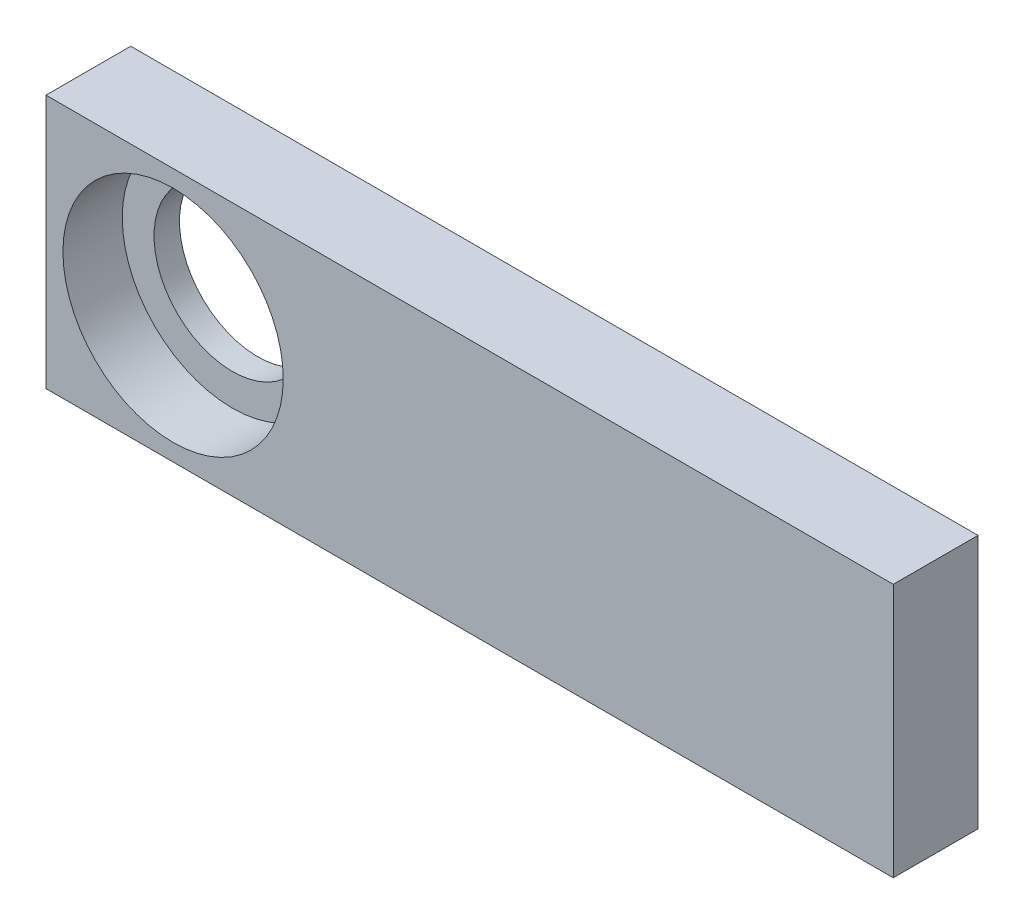
ISO-10303-21;
HEADER;
FILE_DESCRIPTION(('STEP AP214'),'2;1');
FILE_NAME('part.step','',(''),(''),'','','');
FILE_SCHEMA(('AUTOMOTIVE_DESIGN { 1 0 10303 214 1 1 1 1 }'));
ENDSEC;
DATA;
#1=APPLICATION_CONTEXT('core data for automotive mechanical design processes');
#2=APPLICATION_PROTOCOL_DEFINITION('international standard','automotive_design',2000,#1);
#3=PRODUCT_CONTEXT('',#1,'mechanical');
#4=PRODUCT('Part','Part','',(#3));
#5=PRODUCT_RELATED_PRODUCT_CATEGORY('part','',(#4));
#6=PRODUCT_DEFINITION_FORMATION('','',#4);
#7=PRODUCT_DEFINITION_CONTEXT('part definition',#1,'design');
#8=PRODUCT_DEFINITION('design','',#6,#7);
#9=PRODUCT_DEFINITION_SHAPE('','',#8);
#10=(LENGTH_UNIT() NAMED_UNIT(*) SI_UNIT(.MILLI.,.METRE.));
#11=(NAMED_UNIT(*) PLANE_ANGLE_UNIT() SI_UNIT($,.RADIAN.));
#12=(NAMED_UNIT(*) SI_UNIT($,.STERADIAN.) SOLID_ANGLE_UNIT());
#13=UNCERTAINTY_MEASURE_WITH_UNIT(LENGTH_MEASURE(1.E-05),#10,'distance_accuracy_value','');
#14=(GEOMETRIC_REPRESENTATION_CONTEXT(3) GLOBAL_UNCERTAINTY_ASSIGNED_CONTEXT((#13)) GLOBAL_UNIT_ASSIGNED_CONTEXT((#10,
#11,#12)) REPRESENTATION_CONTEXT('',''));
#15=CARTESIAN_POINT('',(0.,0.,0.));
#16=DIRECTION('',(0.,0.,1.));
#17=DIRECTION('',(1.,0.,0.));
#18=AXIS2_PLACEMENT_3D('',#15,#16,#17);
#19=CARTESIAN_POINT('',(0.,30.,10.));
#20=DIRECTION('',(1.,0.,0.));
#21=DIRECTION('',(0.,0.,-1.));
#22=AXIS2_PLACEMENT_3D('',#19,#20,#21);
#23=PLANE('',#22);
#24=DIRECTION('',(0.,-1.,0.));
#25=VECTOR('',#24,1.);
#26=CARTESIAN_POINT('',(0.,30.,0.));
#27=LINE('',#26,#25);
#28=CARTESIAN_POINT('',(0.,30.,0.));
#29=VERTEX_POINT('',#28);
#30=CARTESIAN_POINT('',(0.,0.,0.));
#31=VERTEX_POINT('',#30);
#32=EDGE_CURVE('E94',#29,#31,#27,.T.);
#33=ORIENTED_EDGE('',*,*,#32,.T.);
#34=DIRECTION('',(0.,0.,-1.));
#35=VECTOR('',#34,1.);
#36=CARTESIAN_POINT('',(0.,0.,10.));
#37=LINE('',#36,#35);
#38=CARTESIAN_POINT('',(0.,0.,10.));
#39=VERTEX_POINT('',#38);
#40=EDGE_CURVE('E11',#39,#31,#37,.T.);
#41=ORIENTED_EDGE('',*,*,#40,.F.);
#42=DIRECTION('',(0.,-1.,0.));
#43=VECTOR('',#42,1.);
#44=CARTESIAN_POINT('',(0.,30.,10.));
#45=LINE('',#44,#43);
#46=CARTESIAN_POINT('',(0.,30.,10.));
#47=VERTEX_POINT('',#46);
#48=EDGE_CURVE('E82',#47,#39,#45,.T.);
#49=ORIENTED_EDGE('',*,*,#48,.F.);
#50=DIRECTION('',(0.,0.,-1.));
#51=VECTOR('',#50,1.);
#52=CARTESIAN_POINT('',(0.,30.,10.));
#53=LINE('',#52,#51);
#54=EDGE_CURVE('E90',#47,#29,#53,.T.);
#55=ORIENTED_EDGE('',*,*,#54,.T.);
#56=EDGE_LOOP('',(#33,#41,#49,#55));
#57=FACE_BOUND('',#56,.T.);
#58=ADVANCED_FACE('F31',(#57),#23,.F.);
#59=CARTESIAN_POINT('',(0.,0.,10.));
#60=DIRECTION('',(0.,1.,0.));
#61=DIRECTION('',(0.,0.,1.));
#62=AXIS2_PLACEMENT_3D('',#59,#60,#61);
#63=PLANE('',#62);
#64=DIRECTION('',(1.,0.,0.));
#65=VECTOR('',#64,1.);
#66=CARTESIAN_POINT('',(0.,0.,0.));
#67=LINE('',#66,#65);
#68=CARTESIAN_POINT('',(100.,0.,0.));
#69=VERTEX_POINT('',#68);
#70=EDGE_CURVE('E86',#31,#69,#67,.T.);
#71=ORIENTED_EDGE('',*,*,#70,.T.);
#72=DIRECTION('',(0.,0.,-1.));
#73=VECTOR('',#72,1.);
#74=CARTESIAN_POINT('',(100.,0.,10.));
#75=LINE('',#74,#73);
#76=CARTESIAN_POINT('',(100.,0.,10.));
#77=VERTEX_POINT('',#76);
#78=EDGE_CURVE('E39',#77,#69,#75,.T.);
#79=ORIENTED_EDGE('',*,*,#78,.F.);
#80=DIRECTION('',(1.,0.,0.));
#81=VECTOR('',#80,1.);
#82=CARTESIAN_POINT('',(0.,0.,10.));
#83=LINE('',#82,#81);
#84=EDGE_CURVE('E77',#39,#77,#83,.T.);
#85=ORIENTED_EDGE('',*,*,#84,.F.);
#86=ORIENTED_EDGE('',*,*,#40,.T.);
#87=EDGE_LOOP('',(#71,#79,#85,#86));
#88=FACE_BOUND('',#87,.T.);
#89=ADVANCED_FACE('F85',(#88),#63,.F.);
#90=CARTESIAN_POINT('',(100.,30.,10.));
#91=DIRECTION('',(-1.,0.,0.));
#92=DIRECTION('',(0.,0.,1.));
#93=AXIS2_PLACEMENT_3D('',#90,#91,#92);
#94=PLANE('',#93);
#95=DIRECTION('',(0.,1.,0.));
#96=VECTOR('',#95,1.);
#97=CARTESIAN_POINT('',(100.,30.,0.));
#98=LINE('',#97,#96);
#99=CARTESIAN_POINT('',(100.,30.,0.));
#100=VERTEX_POINT('',#99);
#101=EDGE_CURVE('E64',#69,#100,#98,.T.);
#102=ORIENTED_EDGE('',*,*,#101,.T.);
#103=DIRECTION('',(0.,0.,-1.));
#104=VECTOR('',#103,1.);
#105=CARTESIAN_POINT('',(100.,30.,10.));
#106=LINE('',#105,#104);
#107=CARTESIAN_POINT('',(100.,30.,10.));
#108=VERTEX_POINT('',#107);
#109=EDGE_CURVE('E87',#108,#100,#106,.T.);
#110=ORIENTED_EDGE('',*,*,#109,.F.);
#111=DIRECTION('',(0.,1.,0.));
#112=VECTOR('',#111,1.);
#113=CARTESIAN_POINT('',(100.,30.,10.));
#114=LINE('',#113,#112);
#115=EDGE_CURVE('E80',#77,#108,#114,.T.);
#116=ORIENTED_EDGE('',*,*,#115,.F.);
#117=ORIENTED_EDGE('',*,*,#78,.T.);
#118=EDGE_LOOP('',(#102,#110,#116,#117));
#119=FACE_BOUND('',#118,.T.);
#120=ADVANCED_FACE('F88',(#119),#94,.F.);
#121=CARTESIAN_POINT('',(0.,30.,10.));
#122=DIRECTION('',(0.,-1.,0.));
#123=DIRECTION('',(0.,0.,-1.));
#124=AXIS2_PLACEMENT_3D('',#121,#122,#123);
#125=PLANE('',#124);
#126=DIRECTION('',(-1.,0.,0.));
#127=VECTOR('',#126,1.);
#128=CARTESIAN_POINT('',(0.,30.,0.));
#129=LINE('',#128,#127);
#130=EDGE_CURVE('E70',#100,#29,#129,.T.);
#131=ORIENTED_EDGE('',*,*,#130,.T.);
#132=ORIENTED_EDGE('',*,*,#54,.F.);
#133=DIRECTION('',(-1.,0.,0.));
#134=VECTOR('',#133,1.);
#135=CARTESIAN_POINT('',(0.,30.,10.));
#136=LINE('',#135,#134);
#137=EDGE_CURVE('E47',#108,#47,#136,.T.);
#138=ORIENTED_EDGE('',*,*,#137,.F.);
#139=ORIENTED_EDGE('',*,*,#109,.T.);
#140=EDGE_LOOP('',(#131,#132,#138,#139));
#141=FACE_BOUND('',#140,.T.);
#142=ADVANCED_FACE('F102',(#141),#125,.F.);
#143=CARTESIAN_POINT('',(0.,0.,10.));
#144=DIRECTION('',(0.,0.,1.));
#145=DIRECTION('',(1.,0.,0.));
#146=AXIS2_PLACEMENT_3D('',#143,#144,#145);
#147=PLANE('',#146);
#148=CARTESIAN_POINT('',(15.,15.,10.));
#149=DIRECTION('',(0.,0.,1.));
#150=DIRECTION('',(1.,0.,0.));
#151=AXIS2_PLACEMENT_3D('',#148,#149,#150);
#152=CIRCLE('',#151,13.);
#153=CARTESIAN_POINT('',(28.,15.,10.));
#154=VERTEX_POINT('',#153);
#155=EDGE_CURVE('E108',#154,#154,#152,.T.);
#156=ORIENTED_EDGE('',*,*,#155,.F.);
#157=EDGE_LOOP('',(#156));
#158=FACE_BOUND('',#157,.T.);
#159=ORIENTED_EDGE('',*,*,#48,.T.);
#160=ORIENTED_EDGE('',*,*,#84,.T.);
#161=ORIENTED_EDGE('',*,*,#115,.T.);
#162=ORIENTED_EDGE('',*,*,#137,.T.);
#163=EDGE_LOOP('',(#159,#160,#161,#162));
#164=FACE_BOUND('',#163,.T.);
#165=ADVANCED_FACE('F78',(#158,#164),#147,.T.);
#166=CARTESIAN_POINT('',(0.,0.,0.));
#167=DIRECTION('',(0.,0.,1.));
#168=DIRECTION('',(1.,0.,0.));
#169=AXIS2_PLACEMENT_3D('',#166,#167,#168);
#170=PLANE('',#169);
#171=CARTESIAN_POINT('',(15.,15.,0.));
#172=DIRECTION('',(0.,0.,1.));
#173=DIRECTION('',(1.,0.,0.));
#174=AXIS2_PLACEMENT_3D('',#171,#172,#173);
#175=CIRCLE('',#174,9.25);
#176=CARTESIAN_POINT('',(24.25,15.,0.));
#177=VERTEX_POINT('',#176);
#178=EDGE_CURVE('E111',#177,#177,#175,.T.);
#179=ORIENTED_EDGE('',*,*,#178,.T.);
#180=EDGE_LOOP('',(#179));
#181=FACE_BOUND('',#180,.T.);
#182=ORIENTED_EDGE('',*,*,#32,.F.);
#183=ORIENTED_EDGE('',*,*,#130,.F.);
#184=ORIENTED_EDGE('',*,*,#101,.F.);
#185=ORIENTED_EDGE('',*,*,#70,.F.);
#186=EDGE_LOOP('',(#182,#183,#184,#185));
#187=FACE_BOUND('',#186,.T.);
#188=ADVANCED_FACE('F105',(#181,#187),#170,.F.);
#189=CARTESIAN_POINT('',(15.,15.,3.));
#190=DIRECTION('',(0.,0.,1.));
#191=DIRECTION('',(1.,0.,0.));
#192=AXIS2_PLACEMENT_3D('',#189,#190,#191);
#193=CYLINDRICAL_SURFACE('',#192,13.);
#194=CARTESIAN_POINT('',(15.,15.,3.));
#195=DIRECTION('',(0.,0.,1.));
#196=DIRECTION('',(1.,0.,0.));
#197=AXIS2_PLACEMENT_3D('',#194,#195,#196);
#198=CIRCLE('',#197,13.);
#199=CARTESIAN_POINT('',(28.,15.,3.));
#200=VERTEX_POINT('',#199);
#201=EDGE_CURVE('E97',#200,#200,#198,.T.);
#202=ORIENTED_EDGE('',*,*,#201,.F.);
#203=EDGE_LOOP('',(#202));
#204=FACE_BOUND('',#203,.T.);
#205=ORIENTED_EDGE('',*,*,#155,.T.);
#206=EDGE_LOOP('',(#205));
#207=FACE_BOUND('',#206,.T.);
#208=ADVANCED_FACE('F130',(#204,#207),#193,.F.);
#209=CARTESIAN_POINT('',(15.,15.,3.));
#210=DIRECTION('',(0.,0.,1.));
#211=DIRECTION('',(1.,0.,0.));
#212=AXIS2_PLACEMENT_3D('',#209,#210,#211);
#213=PLANE('',#212);
#214=CARTESIAN_POINT('',(15.,15.,3.));
#215=DIRECTION('',(0.,0.,1.));
#216=DIRECTION('',(1.,0.,0.));
#217=AXIS2_PLACEMENT_3D('',#214,#215,#216);
#218=CIRCLE('',#217,9.25);
#219=CARTESIAN_POINT('',(24.25,15.,3.));
#220=VERTEX_POINT('',#219);
#221=EDGE_CURVE('E114',#220,#220,#218,.T.);
#222=ORIENTED_EDGE('',*,*,#221,.F.);
#223=EDGE_LOOP('',(#222));
#224=FACE_BOUND('',#223,.T.);
#225=ORIENTED_EDGE('',*,*,#201,.T.);
#226=EDGE_LOOP('',(#225));
#227=FACE_BOUND('',#226,.T.);
#228=ADVANCED_FACE('F124',(#224,#227),#213,.T.);
#229=CARTESIAN_POINT('',(15.,15.,0.));
#230=DIRECTION('',(0.,0.,1.));
#231=DIRECTION('',(1.,0.,0.));
#232=AXIS2_PLACEMENT_3D('',#229,#230,#231);
#233=CYLINDRICAL_SURFACE('',#232,9.25);
#234=ORIENTED_EDGE('',*,*,#178,.F.);
#235=EDGE_LOOP('',(#234));
#236=FACE_BOUND('',#235,.T.);
#237=ORIENTED_EDGE('',*,*,#221,.T.);
#238=EDGE_LOOP('',(#237));
#239=FACE_BOUND('',#238,.T.);
#240=ADVANCED_FACE('F121',(#236,#239),#233,.F.);
#241=CLOSED_SHELL('',(#58,#89,#120,#142,#165,#188,#208,#228,#240));
#242=MANIFOLD_SOLID_BREP('B2',#241);
#243=ADVANCED_BREP_SHAPE_REPRESENTATION('',(#18,#242),#14);
#244=SHAPE_DEFINITION_REPRESENTATION(#9,#243);
ENDSEC;
END-ISO-10303-21;
